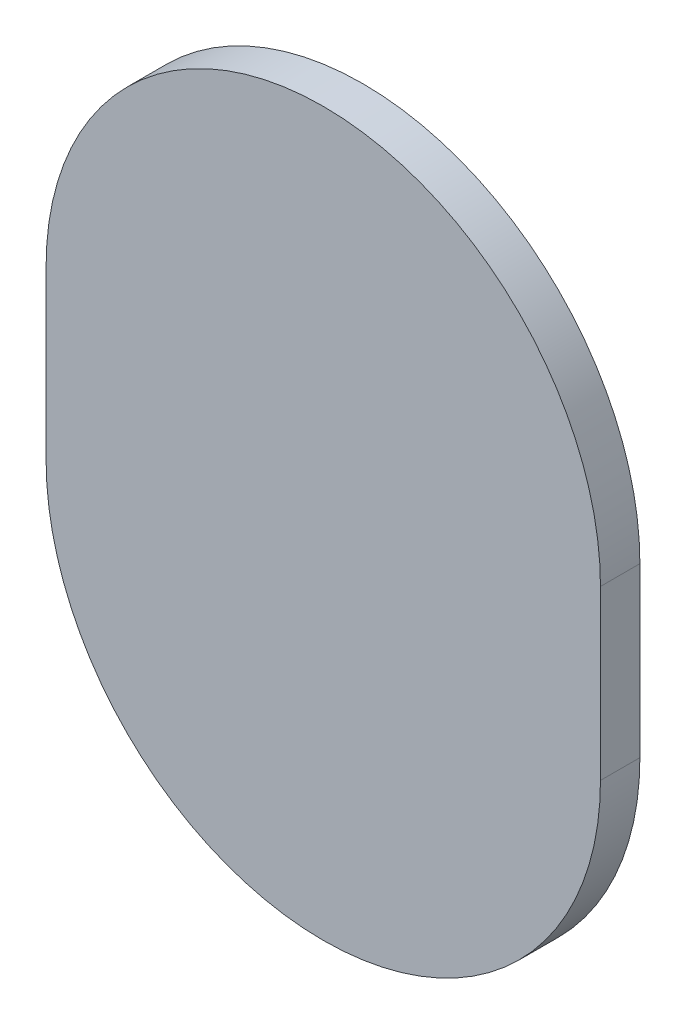
ISO-10303-21;
HEADER;
FILE_DESCRIPTION(('STEP AP214'),'2;1');
FILE_NAME('part.step','',(''),(''),'','','');
FILE_SCHEMA(('AUTOMOTIVE_DESIGN { 1 0 10303 214 1 1 1 1 }'));
ENDSEC;
DATA;
#1=APPLICATION_CONTEXT('core data for automotive mechanical design processes');
#2=APPLICATION_PROTOCOL_DEFINITION('international standard','automotive_design',2000,#1);
#3=PRODUCT_CONTEXT('',#1,'mechanical');
#4=PRODUCT('Part','Part','',(#3));
#5=PRODUCT_RELATED_PRODUCT_CATEGORY('part','',(#4));
#6=PRODUCT_DEFINITION_FORMATION('','',#4);
#7=PRODUCT_DEFINITION_CONTEXT('part definition',#1,'design');
#8=PRODUCT_DEFINITION('design','',#6,#7);
#9=PRODUCT_DEFINITION_SHAPE('','',#8);
#10=(LENGTH_UNIT() NAMED_UNIT(*) SI_UNIT(.MILLI.,.METRE.));
#11=(NAMED_UNIT(*) PLANE_ANGLE_UNIT() SI_UNIT($,.RADIAN.));
#12=(NAMED_UNIT(*) SI_UNIT($,.STERADIAN.) SOLID_ANGLE_UNIT());
#13=UNCERTAINTY_MEASURE_WITH_UNIT(LENGTH_MEASURE(1.E-05),#10,'distance_accuracy_value','');
#14=(GEOMETRIC_REPRESENTATION_CONTEXT(3) GLOBAL_UNCERTAINTY_ASSIGNED_CONTEXT((#13)) GLOBAL_UNIT_ASSIGNED_CONTEXT((#10,
#11,#12)) REPRESENTATION_CONTEXT('',''));
#15=CARTESIAN_POINT('',(0.,0.,0.));
#16=DIRECTION('',(0.,0.,1.));
#17=DIRECTION('',(1.,0.,0.));
#18=AXIS2_PLACEMENT_3D('',#15,#16,#17);
#19=CARTESIAN_POINT('',(80.50401984,66.6459805,0.));
#20=DIRECTION('',(-1.,0.,0.));
#21=DIRECTION('',(0.,1.,0.));
#22=AXIS2_PLACEMENT_3D('',#19,#20,#21);
#23=PLANE('',#22);
#24=DIRECTION('',(0.,1.,0.));
#25=VECTOR('',#24,1.);
#26=CARTESIAN_POINT('',(80.50401984,66.6459805,0.03556));
#27=LINE('',#26,#25);
#28=CARTESIAN_POINT('',(80.50401984,66.6459805,0.03556));
#29=VERTEX_POINT('',#28);
#30=CARTESIAN_POINT('',(80.50401984,66.7974915,0.03556));
#31=VERTEX_POINT('',#30);
#32=EDGE_CURVE('E11',#29,#31,#27,.T.);
#33=ORIENTED_EDGE('',*,*,#32,.F.);
#34=DIRECTION('',(0.,0.,1.));
#35=VECTOR('',#34,1.);
#36=CARTESIAN_POINT('',(80.50401984,66.6459805,0.));
#37=LINE('',#36,#35);
#38=CARTESIAN_POINT('',(80.50401984,66.6459805,0.));
#39=VERTEX_POINT('',#38);
#40=EDGE_CURVE('E24',#39,#29,#37,.T.);
#41=ORIENTED_EDGE('',*,*,#40,.F.);
#42=DIRECTION('',(0.,1.,0.));
#43=VECTOR('',#42,1.);
#44=CARTESIAN_POINT('',(80.50401984,66.6459805,0.));
#45=LINE('',#44,#43);
#46=CARTESIAN_POINT('',(80.50401984,66.7974915,0.));
#47=VERTEX_POINT('',#46);
#48=EDGE_CURVE('E75',#39,#47,#45,.T.);
#49=ORIENTED_EDGE('',*,*,#48,.T.);
#50=DIRECTION('',(0.,0.,1.));
#51=VECTOR('',#50,1.);
#52=CARTESIAN_POINT('',(80.50401984,66.7974915,0.));
#53=LINE('',#52,#51);
#54=EDGE_CURVE('E37',#47,#31,#53,.T.);
#55=ORIENTED_EDGE('',*,*,#54,.T.);
#56=EDGE_LOOP('',(#33,#41,#49,#55));
#57=FACE_BOUND('',#56,.T.);
#58=ADVANCED_FACE('F17',(#57),#23,.F.);
#59=CARTESIAN_POINT('',(80.25402034,66.7974915,0.));
#60=DIRECTION('',(0.,0.,-1.));
#61=DIRECTION('',(1.,0.,0.));
#62=AXIS2_PLACEMENT_3D('',#59,#60,#61);
#63=CYLINDRICAL_SURFACE('',#62,0.249999500000001);
#64=CARTESIAN_POINT('',(80.25402034,66.7974915,0.03556));
#65=DIRECTION('',(0.,0.,1.));
#66=DIRECTION('',(1.,0.,0.));
#67=AXIS2_PLACEMENT_3D('',#64,#65,#66);
#68=CIRCLE('',#67,0.249999500000001);
#69=CARTESIAN_POINT('',(80.00402084,66.7974915,0.03556));
#70=VERTEX_POINT('',#69);
#71=EDGE_CURVE('E83',#31,#70,#68,.T.);
#72=ORIENTED_EDGE('',*,*,#71,.F.);
#73=ORIENTED_EDGE('',*,*,#54,.F.);
#74=CARTESIAN_POINT('',(80.25402034,66.7974915,0.));
#75=DIRECTION('',(0.,0.,1.));
#76=DIRECTION('',(1.,0.,0.));
#77=AXIS2_PLACEMENT_3D('',#74,#75,#76);
#78=CIRCLE('',#77,0.249999500000001);
#79=CARTESIAN_POINT('',(80.00402084,66.7974915,0.));
#80=VERTEX_POINT('',#79);
#81=EDGE_CURVE('E81',#47,#80,#78,.T.);
#82=ORIENTED_EDGE('',*,*,#81,.T.);
#83=DIRECTION('',(0.,0.,1.));
#84=VECTOR('',#83,1.);
#85=CARTESIAN_POINT('',(80.00402084,66.7974915,0.));
#86=LINE('',#85,#84);
#87=EDGE_CURVE('E67',#80,#70,#86,.T.);
#88=ORIENTED_EDGE('',*,*,#87,.T.);
#89=EDGE_LOOP('',(#72,#73,#82,#88));
#90=FACE_BOUND('',#89,.T.);
#91=ADVANCED_FACE('F89',(#90),#63,.T.);
#92=CARTESIAN_POINT('',(80.00402084,66.7974915,0.));
#93=DIRECTION('',(1.,0.,0.));
#94=DIRECTION('',(0.,-1.,0.));
#95=AXIS2_PLACEMENT_3D('',#92,#93,#94);
#96=PLANE('',#95);
#97=DIRECTION('',(0.,-1.,0.));
#98=VECTOR('',#97,1.);
#99=CARTESIAN_POINT('',(80.00402084,66.7974915,0.03556));
#100=LINE('',#99,#98);
#101=CARTESIAN_POINT('',(80.00402084,66.6459805,0.03556));
#102=VERTEX_POINT('',#101);
#103=EDGE_CURVE('E71',#70,#102,#100,.T.);
#104=ORIENTED_EDGE('',*,*,#103,.F.);
#105=ORIENTED_EDGE('',*,*,#87,.F.);
#106=DIRECTION('',(0.,-1.,0.));
#107=VECTOR('',#106,1.);
#108=CARTESIAN_POINT('',(80.00402084,66.7974915,0.));
#109=LINE('',#108,#107);
#110=CARTESIAN_POINT('',(80.00402084,66.6459805,0.));
#111=VERTEX_POINT('',#110);
#112=EDGE_CURVE('E63',#80,#111,#109,.T.);
#113=ORIENTED_EDGE('',*,*,#112,.T.);
#114=DIRECTION('',(0.,0.,1.));
#115=VECTOR('',#114,1.);
#116=CARTESIAN_POINT('',(80.00402084,66.6459805,0.));
#117=LINE('',#116,#115);
#118=EDGE_CURVE('E53',#111,#102,#117,.T.);
#119=ORIENTED_EDGE('',*,*,#118,.T.);
#120=EDGE_LOOP('',(#104,#105,#113,#119));
#121=FACE_BOUND('',#120,.T.);
#122=ADVANCED_FACE('F66',(#121),#96,.F.);
#123=CARTESIAN_POINT('',(80.25402034,66.6459805,0.));
#124=DIRECTION('',(0.,0.,-1.));
#125=DIRECTION('',(-1.,0.,0.));
#126=AXIS2_PLACEMENT_3D('',#123,#124,#125);
#127=CYLINDRICAL_SURFACE('',#126,0.249999500000001);
#128=CARTESIAN_POINT('',(80.25402034,66.6459805,0.03556));
#129=DIRECTION('',(0.,0.,1.));
#130=DIRECTION('',(-1.,0.,0.));
#131=AXIS2_PLACEMENT_3D('',#128,#129,#130);
#132=CIRCLE('',#131,0.249999500000001);
#133=EDGE_CURVE('E59',#102,#29,#132,.T.);
#134=ORIENTED_EDGE('',*,*,#133,.F.);
#135=ORIENTED_EDGE('',*,*,#118,.F.);
#136=CARTESIAN_POINT('',(80.25402034,66.6459805,0.));
#137=DIRECTION('',(0.,0.,1.));
#138=DIRECTION('',(-1.,0.,0.));
#139=AXIS2_PLACEMENT_3D('',#136,#137,#138);
#140=CIRCLE('',#139,0.249999500000001);
#141=EDGE_CURVE('E57',#111,#39,#140,.T.);
#142=ORIENTED_EDGE('',*,*,#141,.T.);
#143=ORIENTED_EDGE('',*,*,#40,.T.);
#144=EDGE_LOOP('',(#134,#135,#142,#143));
#145=FACE_BOUND('',#144,.T.);
#146=ADVANCED_FACE('F55',(#145),#127,.T.);
#147=CARTESIAN_POINT('',(80.50401984,66.6459805,0.));
#148=DIRECTION('',(0.,0.,-1.));
#149=DIRECTION('',(-1.,0.,0.));
#150=AXIS2_PLACEMENT_3D('',#147,#148,#149);
#151=PLANE('',#150);
#152=ORIENTED_EDGE('',*,*,#141,.F.);
#153=ORIENTED_EDGE('',*,*,#112,.F.);
#154=ORIENTED_EDGE('',*,*,#81,.F.);
#155=ORIENTED_EDGE('',*,*,#48,.F.);
#156=EDGE_LOOP('',(#152,#153,#154,#155));
#157=FACE_BOUND('',#156,.T.);
#158=ADVANCED_FACE('F74',(#157),#151,.T.);
#159=CARTESIAN_POINT('',(80.50401984,66.6459805,0.03556));
#160=DIRECTION('',(0.,0.,-1.));
#161=DIRECTION('',(-1.,0.,0.));
#162=AXIS2_PLACEMENT_3D('',#159,#160,#161);
#163=PLANE('',#162);
#164=ORIENTED_EDGE('',*,*,#32,.T.);
#165=ORIENTED_EDGE('',*,*,#71,.T.);
#166=ORIENTED_EDGE('',*,*,#103,.T.);
#167=ORIENTED_EDGE('',*,*,#133,.T.);
#168=EDGE_LOOP('',(#164,#165,#166,#167));
#169=FACE_BOUND('',#168,.T.);
#170=ADVANCED_FACE('F91',(#169),#163,.F.);
#171=CLOSED_SHELL('',(#58,#91,#122,#146,#158,#170));
#172=MANIFOLD_SOLID_BREP('B1',#171);
#173=ADVANCED_BREP_SHAPE_REPRESENTATION('',(#18,#172),#14);
#174=SHAPE_DEFINITION_REPRESENTATION(#9,#173);
ENDSEC;
END-ISO-10303-21;
